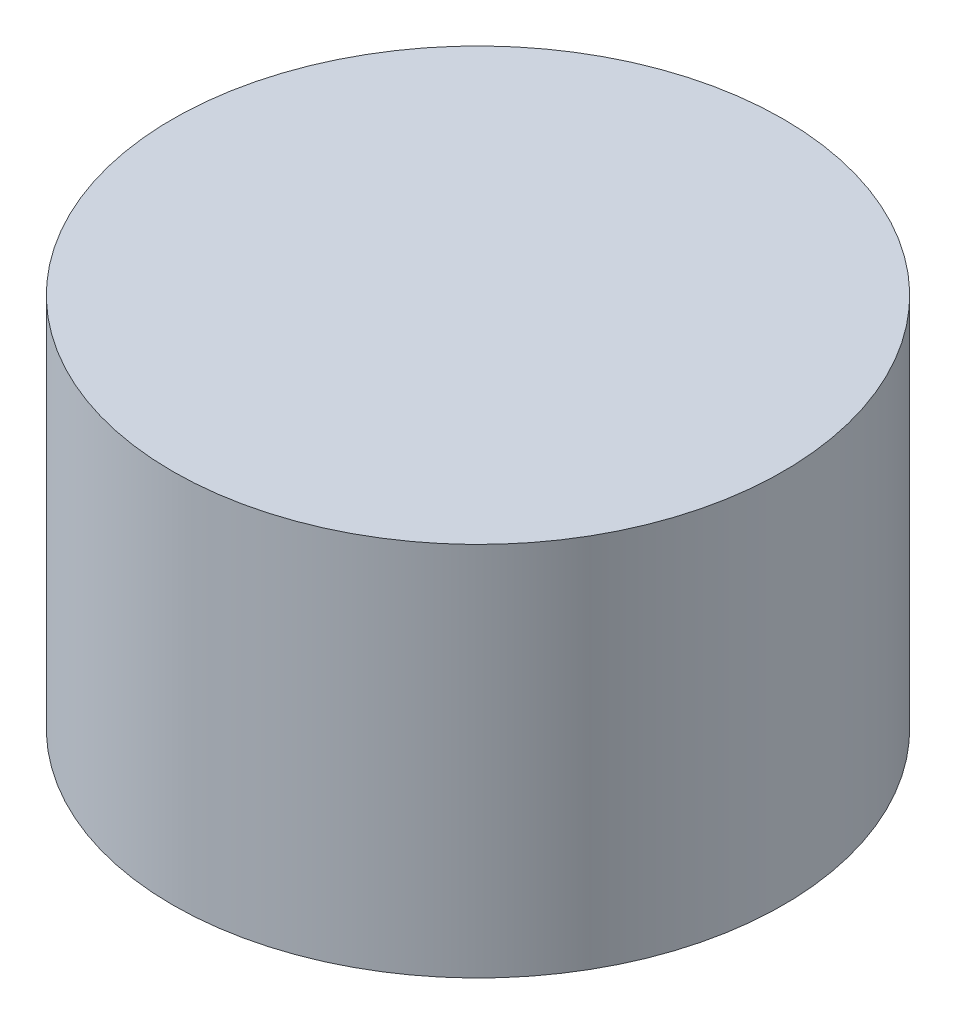
ISO-10303-21;
HEADER;
FILE_DESCRIPTION(('STEP AP214'),'2;1');
FILE_NAME('part.step','',(''),(''),'','','');
FILE_SCHEMA(('AUTOMOTIVE_DESIGN { 1 0 10303 214 1 1 1 1 }'));
ENDSEC;
DATA;
#1=APPLICATION_CONTEXT('core data for automotive mechanical design processes');
#2=APPLICATION_PROTOCOL_DEFINITION('international standard','automotive_design',2000,#1);
#3=PRODUCT_CONTEXT('',#1,'mechanical');
#4=PRODUCT('Part','Part','',(#3));
#5=PRODUCT_RELATED_PRODUCT_CATEGORY('part','',(#4));
#6=PRODUCT_DEFINITION_FORMATION('','',#4);
#7=PRODUCT_DEFINITION_CONTEXT('part definition',#1,'design');
#8=PRODUCT_DEFINITION('design','',#6,#7);
#9=PRODUCT_DEFINITION_SHAPE('','',#8);
#10=(LENGTH_UNIT() NAMED_UNIT(*) SI_UNIT(.MILLI.,.METRE.));
#11=(NAMED_UNIT(*) PLANE_ANGLE_UNIT() SI_UNIT($,.RADIAN.));
#12=(NAMED_UNIT(*) SI_UNIT($,.STERADIAN.) SOLID_ANGLE_UNIT());
#13=UNCERTAINTY_MEASURE_WITH_UNIT(LENGTH_MEASURE(1.E-05),#10,'distance_accuracy_value','');
#14=(GEOMETRIC_REPRESENTATION_CONTEXT(3) GLOBAL_UNCERTAINTY_ASSIGNED_CONTEXT((#13)) GLOBAL_UNIT_ASSIGNED_CONTEXT((#10,
#11,#12)) REPRESENTATION_CONTEXT('',''));
#15=CARTESIAN_POINT('',(0.,0.,0.));
#16=DIRECTION('',(0.,0.,1.));
#17=DIRECTION('',(1.,0.,0.));
#18=AXIS2_PLACEMENT_3D('',#15,#16,#17);
#19=CARTESIAN_POINT('',(0.,20.,0.));
#20=DIRECTION('',(0.,-1.,0.));
#21=DIRECTION('',(0.,0.,-1.));
#22=AXIS2_PLACEMENT_3D('',#19,#20,#21);
#23=CYLINDRICAL_SURFACE('',#22,16.2592296689101);
#24=CARTESIAN_POINT('',(0.,20.,0.));
#25=DIRECTION('',(0.,1.,0.));
#26=DIRECTION('',(0.,0.,1.));
#27=AXIS2_PLACEMENT_3D('',#24,#25,#26);
#28=CIRCLE('',#27,16.2592296689101);
#29=CARTESIAN_POINT('',(0.,20.,16.2592296689101));
#30=VERTEX_POINT('',#29);
#31=EDGE_CURVE('E10',#30,#30,#28,.T.);
#32=ORIENTED_EDGE('',*,*,#31,.F.);
#33=EDGE_LOOP('',(#32));
#34=FACE_BOUND('',#33,.T.);
#35=CARTESIAN_POINT('',(0.,0.,0.));
#36=DIRECTION('',(0.,1.,0.));
#37=DIRECTION('',(0.,0.,1.));
#38=AXIS2_PLACEMENT_3D('',#35,#36,#37);
#39=CIRCLE('',#38,16.2592296689101);
#40=CARTESIAN_POINT('',(0.,0.,16.2592296689101));
#41=VERTEX_POINT('',#40);
#42=EDGE_CURVE('E32',#41,#41,#39,.T.);
#43=ORIENTED_EDGE('',*,*,#42,.T.);
#44=EDGE_LOOP('',(#43));
#45=FACE_BOUND('',#44,.T.);
#46=ADVANCED_FACE('F29',(#34,#45),#23,.T.);
#47=CARTESIAN_POINT('',(0.,20.,0.));
#48=DIRECTION('',(0.,1.,0.));
#49=DIRECTION('',(0.,0.,1.));
#50=AXIS2_PLACEMENT_3D('',#47,#48,#49);
#51=PLANE('',#50);
#52=ORIENTED_EDGE('',*,*,#31,.T.);
#53=EDGE_LOOP('',(#52));
#54=FACE_BOUND('',#53,.T.);
#55=ADVANCED_FACE('F44',(#54),#51,.T.);
#56=CARTESIAN_POINT('',(0.,0.,0.));
#57=DIRECTION('',(0.,1.,0.));
#58=DIRECTION('',(0.,0.,1.));
#59=AXIS2_PLACEMENT_3D('',#56,#57,#58);
#60=PLANE('',#59);
#61=ORIENTED_EDGE('',*,*,#42,.F.);
#62=EDGE_LOOP('',(#61));
#63=FACE_BOUND('',#62,.T.);
#64=ADVANCED_FACE('F42',(#63),#60,.F.);
#65=CLOSED_SHELL('',(#46,#55,#64));
#66=MANIFOLD_SOLID_BREP('B2',#65);
#67=ADVANCED_BREP_SHAPE_REPRESENTATION('',(#18,#66),#14);
#68=SHAPE_DEFINITION_REPRESENTATION(#9,#67);
ENDSEC;
END-ISO-10303-21;
